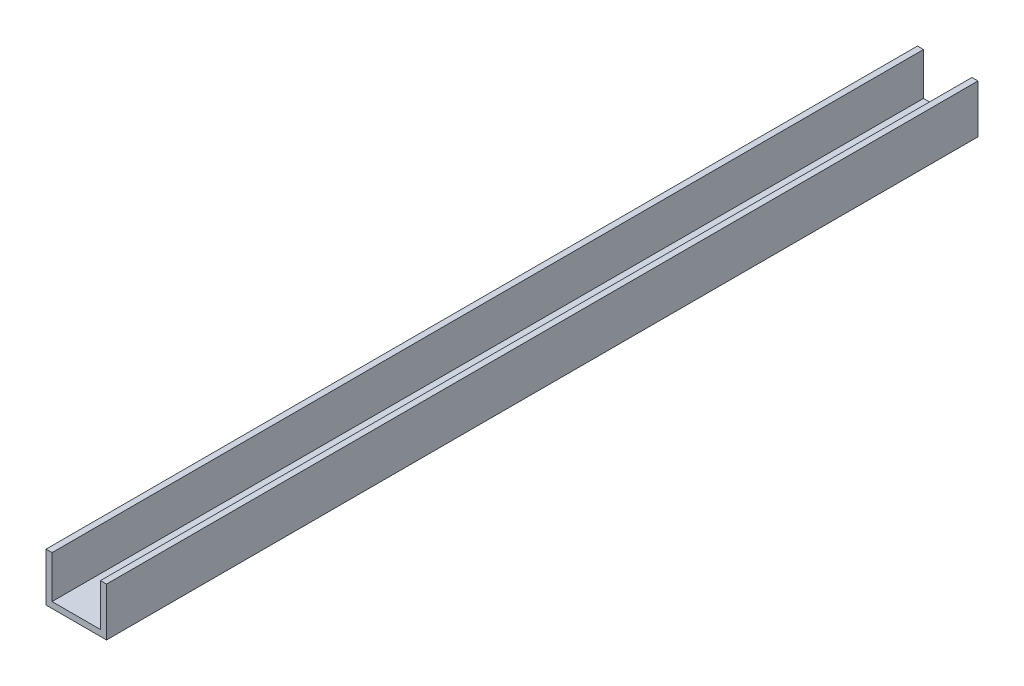
ISO-10303-21;
HEADER;
FILE_DESCRIPTION(('STEP AP214'),'2;1');
FILE_NAME('part.step','',(''),(''),'','','');
FILE_SCHEMA(('AUTOMOTIVE_DESIGN { 1 0 10303 214 1 1 1 1 }'));
ENDSEC;
DATA;
#1=APPLICATION_CONTEXT('core data for automotive mechanical design processes');
#2=APPLICATION_PROTOCOL_DEFINITION('international standard','automotive_design',2000,#1);
#3=PRODUCT_CONTEXT('',#1,'mechanical');
#4=PRODUCT('Part','Part','',(#3));
#5=PRODUCT_RELATED_PRODUCT_CATEGORY('part','',(#4));
#6=PRODUCT_DEFINITION_FORMATION('','',#4);
#7=PRODUCT_DEFINITION_CONTEXT('part definition',#1,'design');
#8=PRODUCT_DEFINITION('design','',#6,#7);
#9=PRODUCT_DEFINITION_SHAPE('','',#8);
#10=(LENGTH_UNIT() NAMED_UNIT(*) SI_UNIT(.MILLI.,.METRE.));
#11=(NAMED_UNIT(*) PLANE_ANGLE_UNIT() SI_UNIT($,.RADIAN.));
#12=(NAMED_UNIT(*) SI_UNIT($,.STERADIAN.) SOLID_ANGLE_UNIT());
#13=UNCERTAINTY_MEASURE_WITH_UNIT(LENGTH_MEASURE(1.E-05),#10,'distance_accuracy_value','');
#14=(GEOMETRIC_REPRESENTATION_CONTEXT(3) GLOBAL_UNCERTAINTY_ASSIGNED_CONTEXT((#13)) GLOBAL_UNIT_ASSIGNED_CONTEXT((#10,
#11,#12)) REPRESENTATION_CONTEXT('',''));
#15=CARTESIAN_POINT('',(0.,0.,0.));
#16=DIRECTION('',(0.,0.,1.));
#17=DIRECTION('',(1.,0.,0.));
#18=AXIS2_PLACEMENT_3D('',#15,#16,#17);
#19=CARTESIAN_POINT('',(-12.7,12.7,609.6));
#20=DIRECTION('',(0.,-1.,0.));
#21=DIRECTION('',(1.,0.,0.));
#22=AXIS2_PLACEMENT_3D('',#19,#20,#21);
#23=PLANE('',#22);
#24=DIRECTION('',(0.,0.,-1.));
#25=VECTOR('',#24,1.);
#26=CARTESIAN_POINT('',(-15.875,12.7,609.6));
#27=LINE('',#26,#25);
#28=CARTESIAN_POINT('',(-15.875,12.7,-406.4));
#29=VERTEX_POINT('',#28);
#30=CARTESIAN_POINT('',(-15.875,12.7,-863.6));
#31=VERTEX_POINT('',#30);
#32=EDGE_CURVE('E11',#29,#31,#27,.T.);
#33=ORIENTED_EDGE('',*,*,#32,.F.);
#34=DIRECTION('',(-1.,0.,0.));
#35=VECTOR('',#34,1.);
#36=CARTESIAN_POINT('',(-15.875,12.7,-406.4));
#37=LINE('',#36,#35);
#38=CARTESIAN_POINT('',(-12.7,12.7,-406.4));
#39=VERTEX_POINT('',#38);
#40=EDGE_CURVE('E63',#39,#29,#37,.T.);
#41=ORIENTED_EDGE('',*,*,#40,.F.);
#42=DIRECTION('',(0.,0.,-1.));
#43=VECTOR('',#42,1.);
#44=CARTESIAN_POINT('',(-12.7,12.7,609.6));
#45=LINE('',#44,#43);
#46=CARTESIAN_POINT('',(-12.7,12.7,-863.6));
#47=VERTEX_POINT('',#46);
#48=EDGE_CURVE('E165',#39,#47,#45,.T.);
#49=ORIENTED_EDGE('',*,*,#48,.T.);
#50=DIRECTION('',(1.,0.,0.));
#51=VECTOR('',#50,1.);
#52=CARTESIAN_POINT('',(-12.7,12.7,-863.6));
#53=LINE('',#52,#51);
#54=EDGE_CURVE('E134',#31,#47,#53,.T.);
#55=ORIENTED_EDGE('',*,*,#54,.F.);
#56=EDGE_LOOP('',(#33,#41,#49,#55));
#57=FACE_BOUND('',#56,.T.);
#58=ADVANCED_FACE('F43',(#57),#23,.F.);
#59=CARTESIAN_POINT('',(-15.875,12.7,609.6));
#60=DIRECTION('',(1.,0.,0.));
#61=DIRECTION('',(0.,1.,0.));
#62=AXIS2_PLACEMENT_3D('',#59,#60,#61);
#63=PLANE('',#62);
#64=DIRECTION('',(0.,0.,-1.));
#65=VECTOR('',#64,1.);
#66=CARTESIAN_POINT('',(-15.875,-12.7,609.6));
#67=LINE('',#66,#65);
#68=CARTESIAN_POINT('',(-15.875,-12.7,-406.4));
#69=VERTEX_POINT('',#68);
#70=CARTESIAN_POINT('',(-15.875,-12.7,-863.6));
#71=VERTEX_POINT('',#70);
#72=EDGE_CURVE('E50',#69,#71,#67,.T.);
#73=ORIENTED_EDGE('',*,*,#72,.F.);
#74=DIRECTION('',(0.,-1.,0.));
#75=VECTOR('',#74,1.);
#76=CARTESIAN_POINT('',(-15.875,-12.7,-406.4));
#77=LINE('',#76,#75);
#78=EDGE_CURVE('E152',#29,#69,#77,.T.);
#79=ORIENTED_EDGE('',*,*,#78,.F.);
#80=ORIENTED_EDGE('',*,*,#32,.T.);
#81=DIRECTION('',(0.,1.,0.));
#82=VECTOR('',#81,1.);
#83=CARTESIAN_POINT('',(-15.875,12.7,-863.6));
#84=LINE('',#83,#82);
#85=EDGE_CURVE('E124',#71,#31,#84,.T.);
#86=ORIENTED_EDGE('',*,*,#85,.F.);
#87=EDGE_LOOP('',(#73,#79,#80,#86));
#88=FACE_BOUND('',#87,.T.);
#89=ADVANCED_FACE('F195',(#88),#63,.F.);
#90=CARTESIAN_POINT('',(-15.875,-12.7,609.6));
#91=DIRECTION('',(0.,1.,0.));
#92=DIRECTION('',(0.,0.,1.));
#93=AXIS2_PLACEMENT_3D('',#90,#91,#92);
#94=PLANE('',#93);
#95=CARTESIAN_POINT('',(0.,-12.7,-594.6));
#96=DIRECTION('',(0.,1.,0.));
#97=DIRECTION('',(0.,0.,1.));
#98=AXIS2_PLACEMENT_3D('',#95,#96,#97);
#99=CIRCLE('',#98,3.2);
#100=CARTESIAN_POINT('',(0.,-12.7,-591.4));
#101=VERTEX_POINT('',#100);
#102=EDGE_CURVE('E149',#101,#101,#99,.T.);
#103=ORIENTED_EDGE('',*,*,#102,.T.);
#104=EDGE_LOOP('',(#103));
#105=FACE_BOUND('',#104,.T.);
#106=DIRECTION('',(0.,0.,-1.));
#107=VECTOR('',#106,1.);
#108=CARTESIAN_POINT('',(15.875,-12.7,609.6));
#109=LINE('',#108,#107);
#110=CARTESIAN_POINT('',(15.875,-12.7,-406.4));
#111=VERTEX_POINT('',#110);
#112=CARTESIAN_POINT('',(15.875,-12.7,-863.6));
#113=VERTEX_POINT('',#112);
#114=EDGE_CURVE('E106',#111,#113,#109,.T.);
#115=ORIENTED_EDGE('',*,*,#114,.F.);
#116=DIRECTION('',(1.,0.,0.));
#117=VECTOR('',#116,1.);
#118=CARTESIAN_POINT('',(15.875,-12.7,-406.4));
#119=LINE('',#118,#117);
#120=EDGE_CURVE('E154',#69,#111,#119,.T.);
#121=ORIENTED_EDGE('',*,*,#120,.F.);
#122=ORIENTED_EDGE('',*,*,#72,.T.);
#123=DIRECTION('',(-1.,0.,0.));
#124=VECTOR('',#123,1.);
#125=CARTESIAN_POINT('',(-15.875,-12.7,-863.6));
#126=LINE('',#125,#124);
#127=EDGE_CURVE('E118',#113,#71,#126,.T.);
#128=ORIENTED_EDGE('',*,*,#127,.F.);
#129=EDGE_LOOP('',(#115,#121,#122,#128));
#130=FACE_BOUND('',#129,.T.);
#131=ADVANCED_FACE('F119',(#105,#130),#94,.F.);
#132=CARTESIAN_POINT('',(15.875,-12.7,609.6));
#133=DIRECTION('',(-1.,0.,0.));
#134=DIRECTION('',(0.,-1.,0.));
#135=AXIS2_PLACEMENT_3D('',#132,#133,#134);
#136=PLANE('',#135);
#137=DIRECTION('',(0.,0.,-1.));
#138=VECTOR('',#137,1.);
#139=CARTESIAN_POINT('',(15.875,12.7,609.6));
#140=LINE('',#139,#138);
#141=CARTESIAN_POINT('',(15.875,12.7,-406.4));
#142=VERTEX_POINT('',#141);
#143=CARTESIAN_POINT('',(15.875,12.7,-863.6));
#144=VERTEX_POINT('',#143);
#145=EDGE_CURVE('E115',#142,#144,#140,.T.);
#146=ORIENTED_EDGE('',*,*,#145,.F.);
#147=DIRECTION('',(0.,1.,0.));
#148=VECTOR('',#147,1.);
#149=CARTESIAN_POINT('',(15.875,12.7,-406.4));
#150=LINE('',#149,#148);
#151=EDGE_CURVE('E112',#111,#142,#150,.T.);
#152=ORIENTED_EDGE('',*,*,#151,.F.);
#153=ORIENTED_EDGE('',*,*,#114,.T.);
#154=DIRECTION('',(0.,-1.,0.));
#155=VECTOR('',#154,1.);
#156=CARTESIAN_POINT('',(15.875,-12.7,-863.6));
#157=LINE('',#156,#155);
#158=EDGE_CURVE('E111',#144,#113,#157,.T.);
#159=ORIENTED_EDGE('',*,*,#158,.F.);
#160=EDGE_LOOP('',(#146,#152,#153,#159));
#161=FACE_BOUND('',#160,.T.);
#162=ADVANCED_FACE('F109',(#161),#136,.F.);
#163=CARTESIAN_POINT('',(15.875,12.7,609.6));
#164=DIRECTION('',(0.,-1.,0.));
#165=DIRECTION('',(0.,0.,-1.));
#166=AXIS2_PLACEMENT_3D('',#163,#164,#165);
#167=PLANE('',#166);
#168=DIRECTION('',(0.,0.,-1.));
#169=VECTOR('',#168,1.);
#170=CARTESIAN_POINT('',(12.7,12.7,609.6));
#171=LINE('',#170,#169);
#172=CARTESIAN_POINT('',(12.7,12.7,-406.4));
#173=VERTEX_POINT('',#172);
#174=CARTESIAN_POINT('',(12.7,12.7,-863.6));
#175=VERTEX_POINT('',#174);
#176=EDGE_CURVE('E171',#173,#175,#171,.T.);
#177=ORIENTED_EDGE('',*,*,#176,.F.);
#178=DIRECTION('',(-1.,0.,0.));
#179=VECTOR('',#178,1.);
#180=CARTESIAN_POINT('',(12.7,12.7,-406.4));
#181=LINE('',#180,#179);
#182=EDGE_CURVE('E157',#142,#173,#181,.T.);
#183=ORIENTED_EDGE('',*,*,#182,.F.);
#184=ORIENTED_EDGE('',*,*,#145,.T.);
#185=DIRECTION('',(1.,0.,0.));
#186=VECTOR('',#185,1.);
#187=CARTESIAN_POINT('',(15.875,12.7,-863.6));
#188=LINE('',#187,#186);
#189=EDGE_CURVE('E130',#175,#144,#188,.T.);
#190=ORIENTED_EDGE('',*,*,#189,.F.);
#191=EDGE_LOOP('',(#177,#183,#184,#190));
#192=FACE_BOUND('',#191,.T.);
#193=ADVANCED_FACE('F176',(#192),#167,.F.);
#194=CARTESIAN_POINT('',(12.7,12.7,609.6));
#195=DIRECTION('',(1.,0.,0.));
#196=DIRECTION('',(0.,0.,-1.));
#197=AXIS2_PLACEMENT_3D('',#194,#195,#196);
#198=PLANE('',#197);
#199=DIRECTION('',(0.,0.,-1.));
#200=VECTOR('',#199,1.);
#201=CARTESIAN_POINT('',(12.7,-9.52499999999998,609.6));
#202=LINE('',#201,#200);
#203=CARTESIAN_POINT('',(12.7,-9.52499999999998,-406.4));
#204=VERTEX_POINT('',#203);
#205=CARTESIAN_POINT('',(12.7,-9.52499999999998,-863.6));
#206=VERTEX_POINT('',#205);
#207=EDGE_CURVE('E169',#204,#206,#202,.T.);
#208=ORIENTED_EDGE('',*,*,#207,.F.);
#209=DIRECTION('',(0.,-1.,0.));
#210=VECTOR('',#209,1.);
#211=CARTESIAN_POINT('',(12.7,-9.52499999999998,-406.4));
#212=LINE('',#211,#210);
#213=EDGE_CURVE('E159',#173,#204,#212,.T.);
#214=ORIENTED_EDGE('',*,*,#213,.F.);
#215=ORIENTED_EDGE('',*,*,#176,.T.);
#216=DIRECTION('',(0.,1.,0.));
#217=VECTOR('',#216,1.);
#218=CARTESIAN_POINT('',(12.7,12.7,-863.6));
#219=LINE('',#218,#217);
#220=EDGE_CURVE('E143',#206,#175,#219,.T.);
#221=ORIENTED_EDGE('',*,*,#220,.F.);
#222=EDGE_LOOP('',(#208,#214,#215,#221));
#223=FACE_BOUND('',#222,.T.);
#224=ADVANCED_FACE('F181',(#223),#198,.F.);
#225=CARTESIAN_POINT('',(12.7,-9.52499999999998,609.6));
#226=DIRECTION('',(0.,-1.,0.));
#227=DIRECTION('',(1.,0.,0.));
#228=AXIS2_PLACEMENT_3D('',#225,#226,#227);
#229=PLANE('',#228);
#230=CARTESIAN_POINT('',(0.,-9.52499999999998,-594.6));
#231=DIRECTION('',(0.,1.,0.));
#232=DIRECTION('',(0.,0.,1.));
#233=AXIS2_PLACEMENT_3D('',#230,#231,#232);
#234=CIRCLE('',#233,3.2);
#235=CARTESIAN_POINT('',(0.,-9.52499999999998,-591.4));
#236=VERTEX_POINT('',#235);
#237=EDGE_CURVE('E146',#236,#236,#234,.T.);
#238=ORIENTED_EDGE('',*,*,#237,.F.);
#239=EDGE_LOOP('',(#238));
#240=FACE_BOUND('',#239,.T.);
#241=DIRECTION('',(0.,0.,-1.));
#242=VECTOR('',#241,1.);
#243=CARTESIAN_POINT('',(-12.7,-9.52499999999999,609.6));
#244=LINE('',#243,#242);
#245=CARTESIAN_POINT('',(-12.7,-9.52499999999999,-406.4));
#246=VERTEX_POINT('',#245);
#247=CARTESIAN_POINT('',(-12.7,-9.52499999999999,-863.6));
#248=VERTEX_POINT('',#247);
#249=EDGE_CURVE('E167',#246,#248,#244,.T.);
#250=ORIENTED_EDGE('',*,*,#249,.F.);
#251=DIRECTION('',(-1.,0.,0.));
#252=VECTOR('',#251,1.);
#253=CARTESIAN_POINT('',(-12.7,-9.52499999999999,-406.4));
#254=LINE('',#253,#252);
#255=EDGE_CURVE('E57',#204,#246,#254,.T.);
#256=ORIENTED_EDGE('',*,*,#255,.F.);
#257=ORIENTED_EDGE('',*,*,#207,.T.);
#258=DIRECTION('',(1.,0.,0.));
#259=VECTOR('',#258,1.);
#260=CARTESIAN_POINT('',(12.7,-9.52499999999998,-863.6));
#261=LINE('',#260,#259);
#262=EDGE_CURVE('E140',#248,#206,#261,.T.);
#263=ORIENTED_EDGE('',*,*,#262,.F.);
#264=EDGE_LOOP('',(#250,#256,#257,#263));
#265=FACE_BOUND('',#264,.T.);
#266=ADVANCED_FACE('F186',(#240,#265),#229,.F.);
#267=CARTESIAN_POINT('',(-12.7,-9.52499999999999,609.6));
#268=DIRECTION('',(-1.,0.,0.));
#269=DIRECTION('',(0.,0.,1.));
#270=AXIS2_PLACEMENT_3D('',#267,#268,#269);
#271=PLANE('',#270);
#272=ORIENTED_EDGE('',*,*,#48,.F.);
#273=DIRECTION('',(0.,1.,0.));
#274=VECTOR('',#273,1.);
#275=CARTESIAN_POINT('',(-12.7,12.7,-406.4));
#276=LINE('',#275,#274);
#277=EDGE_CURVE('E162',#246,#39,#276,.T.);
#278=ORIENTED_EDGE('',*,*,#277,.F.);
#279=ORIENTED_EDGE('',*,*,#249,.T.);
#280=DIRECTION('',(0.,-1.,0.));
#281=VECTOR('',#280,1.);
#282=CARTESIAN_POINT('',(-12.7,-9.52499999999999,-863.6));
#283=LINE('',#282,#281);
#284=EDGE_CURVE('E137',#47,#248,#283,.T.);
#285=ORIENTED_EDGE('',*,*,#284,.F.);
#286=EDGE_LOOP('',(#272,#278,#279,#285));
#287=FACE_BOUND('',#286,.T.);
#288=ADVANCED_FACE('F191',(#287),#271,.F.);
#289=CARTESIAN_POINT('',(0.,0.,-406.4));
#290=DIRECTION('',(0.,0.,-1.));
#291=DIRECTION('',(-1.,0.,0.));
#292=AXIS2_PLACEMENT_3D('',#289,#290,#291);
#293=PLANE('',#292);
#294=ORIENTED_EDGE('',*,*,#78,.T.);
#295=ORIENTED_EDGE('',*,*,#120,.T.);
#296=ORIENTED_EDGE('',*,*,#151,.T.);
#297=ORIENTED_EDGE('',*,*,#182,.T.);
#298=ORIENTED_EDGE('',*,*,#213,.T.);
#299=ORIENTED_EDGE('',*,*,#255,.T.);
#300=ORIENTED_EDGE('',*,*,#277,.T.);
#301=ORIENTED_EDGE('',*,*,#40,.T.);
#302=EDGE_LOOP('',(#294,#295,#296,#297,#298,#299,#300,#301));
#303=FACE_BOUND('',#302,.T.);
#304=ADVANCED_FACE('F178',(#303),#293,.F.);
#305=CARTESIAN_POINT('',(0.,-9.52499999999998,-594.6));
#306=DIRECTION('',(0.,1.,0.));
#307=DIRECTION('',(0.,0.,1.));
#308=AXIS2_PLACEMENT_3D('',#305,#306,#307);
#309=CYLINDRICAL_SURFACE('',#308,3.2);
#310=ORIENTED_EDGE('',*,*,#102,.F.);
#311=EDGE_LOOP('',(#310));
#312=FACE_BOUND('',#311,.T.);
#313=ORIENTED_EDGE('',*,*,#237,.T.);
#314=EDGE_LOOP('',(#313));
#315=FACE_BOUND('',#314,.T.);
#316=ADVANCED_FACE('F217',(#312,#315),#309,.F.);
#317=CARTESIAN_POINT('',(0.,0.,-863.6));
#318=DIRECTION('',(0.,0.,1.));
#319=DIRECTION('',(1.,0.,0.));
#320=AXIS2_PLACEMENT_3D('',#317,#318,#319);
#321=PLANE('',#320);
#322=ORIENTED_EDGE('',*,*,#158,.T.);
#323=ORIENTED_EDGE('',*,*,#127,.T.);
#324=ORIENTED_EDGE('',*,*,#85,.T.);
#325=ORIENTED_EDGE('',*,*,#54,.T.);
#326=ORIENTED_EDGE('',*,*,#284,.T.);
#327=ORIENTED_EDGE('',*,*,#262,.T.);
#328=ORIENTED_EDGE('',*,*,#220,.T.);
#329=ORIENTED_EDGE('',*,*,#189,.T.);
#330=EDGE_LOOP('',(#322,#323,#324,#325,#326,#327,#328,#329));
#331=FACE_BOUND('',#330,.T.);
#332=ADVANCED_FACE('F127',(#331),#321,.F.);
#333=CLOSED_SHELL('',(#58,#89,#131,#162,#193,#224,#266,#288,#304,#316,#332));
#334=MANIFOLD_SOLID_BREP('B2',#333);
#335=ADVANCED_BREP_SHAPE_REPRESENTATION('',(#18,#334),#14);
#336=SHAPE_DEFINITION_REPRESENTATION(#9,#335);
ENDSEC;
END-ISO-10303-21;
